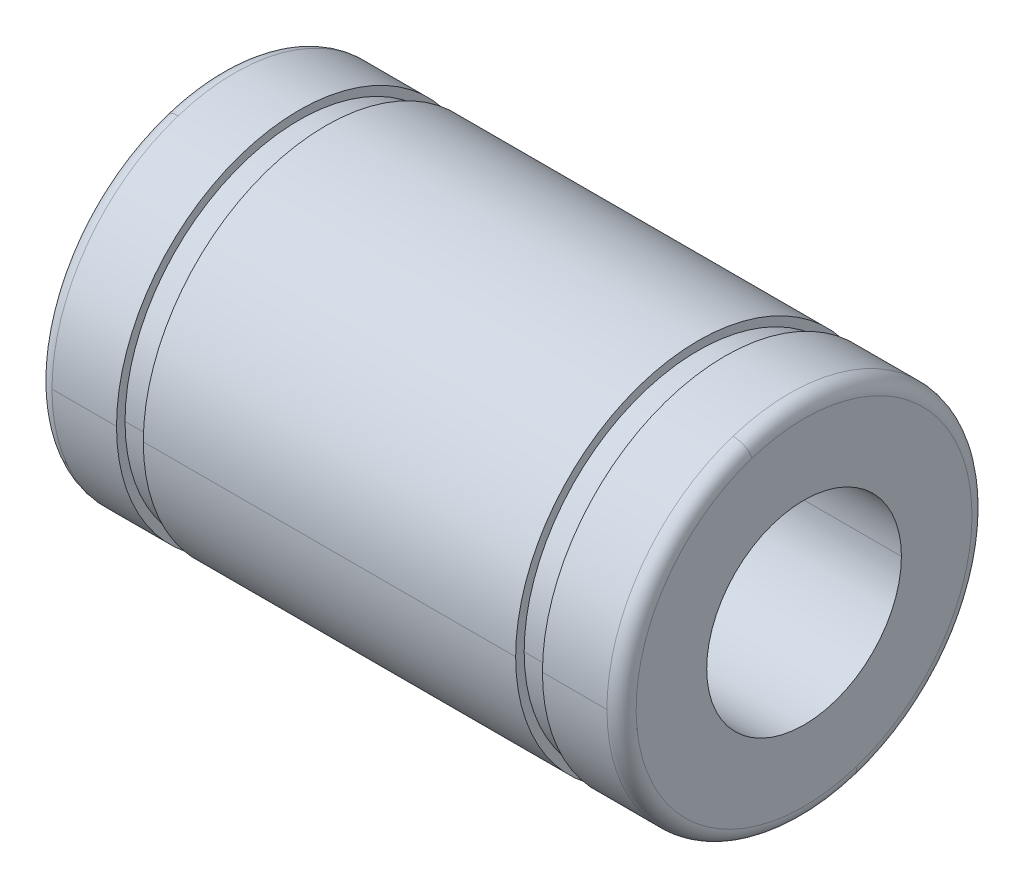
ISO-10303-21;
HEADER;
FILE_DESCRIPTION(('STEP AP214'),'2;1');
FILE_NAME('part.step','',(''),(''),'','','');
FILE_SCHEMA(('AUTOMOTIVE_DESIGN { 1 0 10303 214 1 1 1 1 }'));
ENDSEC;
DATA;
#1=APPLICATION_CONTEXT('core data for automotive mechanical design processes');
#2=APPLICATION_PROTOCOL_DEFINITION('international standard','automotive_design',2000,#1);
#3=PRODUCT_CONTEXT('',#1,'mechanical');
#4=PRODUCT('Part','Part','',(#3));
#5=PRODUCT_RELATED_PRODUCT_CATEGORY('part','',(#4));
#6=PRODUCT_DEFINITION_FORMATION('','',#4);
#7=PRODUCT_DEFINITION_CONTEXT('part definition',#1,'design');
#8=PRODUCT_DEFINITION('design','',#6,#7);
#9=PRODUCT_DEFINITION_SHAPE('','',#8);
#10=(LENGTH_UNIT() NAMED_UNIT(*) SI_UNIT(.MILLI.,.METRE.));
#11=(NAMED_UNIT(*) PLANE_ANGLE_UNIT() SI_UNIT($,.RADIAN.));
#12=(NAMED_UNIT(*) SI_UNIT($,.STERADIAN.) SOLID_ANGLE_UNIT());
#13=UNCERTAINTY_MEASURE_WITH_UNIT(LENGTH_MEASURE(1.E-05),#10,'distance_accuracy_value','');
#14=(GEOMETRIC_REPRESENTATION_CONTEXT(3) GLOBAL_UNCERTAINTY_ASSIGNED_CONTEXT((#13)) GLOBAL_UNIT_ASSIGNED_CONTEXT((#10,
#11,#12)) REPRESENTATION_CONTEXT('',''));
#15=CARTESIAN_POINT('',(0.,0.,0.));
#16=DIRECTION('',(0.,0.,1.));
#17=DIRECTION('',(1.,0.,0.));
#18=AXIS2_PLACEMENT_3D('',#15,#16,#17);
#19=CARTESIAN_POINT('',(0.600000000000046,0.,0.));
#20=DIRECTION('',(1.,0.,0.));
#21=DIRECTION('',(0.,-0.309016994374947,0.951056516295154));
#22=AXIS2_PLACEMENT_3D('',#19,#20,#21);
#23=TOROIDAL_SURFACE('',#22,6.9,0.600000000000046);
#24=CARTESIAN_POINT('',(0.600000000000046,-6.56228996243656,-2.13221726118714));
#25=DIRECTION('',(0.,0.309016994374947,-0.951056516295154));
#26=DIRECTION('',(0.,-0.951056516295154,-0.309016994374947));
#27=AXIS2_PLACEMENT_3D('',#24,#25,#26);
#28=CIRCLE('',#27,0.600000000000046);
#29=CARTESIAN_POINT('',(0.599999999999998,-7.1329238722137,-2.31762745781212));
#30=VERTEX_POINT('',#29);
#31=CARTESIAN_POINT('',(0.,-6.56228996243656,-2.13221726118714));
#32=VERTEX_POINT('',#31);
#33=EDGE_CURVE('E10',#30,#32,#28,.T.);
#34=ORIENTED_EDGE('',*,*,#33,.T.);
#35=CARTESIAN_POINT('',(0.,-6.56228996243656,-2.13221726118714));
#36=CARTESIAN_POINT('',(0.,-6.52740388155008,-2.23959332810784));
#37=CARTESIAN_POINT('',(0.,-6.48987800497312,-2.34611145914393));
#38=CARTESIAN_POINT('',(0.,-6.40964690425732,-2.55717897852581));
#39=CARTESIAN_POINT('',(0.,-6.36694168011848,-2.66172836687159));
#40=CARTESIAN_POINT('',(0.,-6.276452128098,-2.86860552995175));
#41=CARTESIAN_POINT('',(0.,-6.22866780021635,-2.97093330468613));
#42=CARTESIAN_POINT('',(0.,-6.12813586387167,-3.17312099253332));
#43=CARTESIAN_POINT('',(0.,-6.07538825540865,-3.27298090564614));
#44=CARTESIAN_POINT('',(0.,-5.96505664219596,-3.46999222701183));
#45=CARTESIAN_POINT('',(0.,-5.9074726374463,-3.56714363526472));
#46=CARTESIAN_POINT('',(0.,-5.78760700729814,-3.7585039199405));
#47=CARTESIAN_POINT('',(0.,-5.72532538189964,-3.85271279636341));
#48=CARTESIAN_POINT('',(0.,-5.59621453875245,-4.03796105477763));
#49=CARTESIAN_POINT('',(0.,-5.52938532100377,-4.12900043676896));
#50=CARTESIAN_POINT('',(0.,-5.39134029423734,-4.30769038585909));
#51=CARTESIAN_POINT('',(0.,-5.32012448521959,-4.3953409529579));
#52=CARTESIAN_POINT('',(0.,-5.17347784006084,-4.56704211399862));
#53=CARTESIAN_POINT('',(0.,-5.09804700391984,-4.65109270794054));
#54=CARTESIAN_POINT('',(0.,-4.9431520242673,-4.81539143752411));
#55=CARTESIAN_POINT('',(0.,-4.86368788075576,-4.89563957316576));
#56=CARTESIAN_POINT('',(0.,-4.70091772237403,-5.05214006133451));
#57=CARTESIAN_POINT('',(0.,-4.61761170750384,-5.1283924138616));
#58=CARTESIAN_POINT('',(0.,-4.44735849791015,-5.27671763721219));
#59=CARTESIAN_POINT('',(0.,-4.36041130318665,-5.3487905080357));
#60=CARTESIAN_POINT('',(0.,-4.18308519728907,-5.48858313811857));
#61=CARTESIAN_POINT('',(0.,-4.092706286115,-5.55630289737793));
#62=CARTESIAN_POINT('',(0.,-3.9087344780309,-5.68722616150141));
#63=CARTESIAN_POINT('',(0.,-3.81514158112088,-5.75042966636553));
#64=CARTESIAN_POINT('',(0.,-3.62496727505094,-5.87216815891921));
#65=CARTESIAN_POINT('',(0.,-3.52838586589103,-5.93070314660876));
#66=CARTESIAN_POINT('',(0.,-3.33246720839562,-6.04296358890093));
#67=CARTESIAN_POINT('',(0.,-3.23312996006012,-6.09668904350355));
#68=CARTESIAN_POINT('',(0.,-3.03193893634565,-6.19920099029591));
#69=CARTESIAN_POINT('',(0.,-2.93008516096668,-6.24798748248565));
#70=CARTESIAN_POINT('',(0.,-2.72410645783153,-6.34050397351939));
#71=CARTESIAN_POINT('',(0.,-2.61998153007533,-6.38423397236338));
#72=CARTESIAN_POINT('',(0.,-2.40971136825695,-6.4665321273081));
#73=CARTESIAN_POINT('',(0.,-2.30356613419476,-6.50510028340883));
#74=CARTESIAN_POINT('',(0.,-2.08951107293045,-6.57698183880081));
#75=CARTESIAN_POINT('',(0.,-1.98160124572834,-6.61029523809205));
#76=CARTESIAN_POINT('',(0.,-1.76427696240971,-6.67158702496827));
#77=CARTESIAN_POINT('',(0.,-1.65486250629319,-6.69956541255323));
#78=CARTESIAN_POINT('',(0.,-1.43479255415411,-6.75011977363058));
#79=CARTESIAN_POINT('',(0.,-1.32413705813155,-6.77269574712295));
#80=CARTESIAN_POINT('',(0.,-1.10185160496257,-6.81239089251754));
#81=CARTESIAN_POINT('',(0.,-0.990221647816158,-6.82951006441976));
#82=CARTESIAN_POINT('',(0.,-0.766256198743875,-6.85825036504947));
#83=CARTESIAN_POINT('',(0.,-0.653920706818006,-6.86987149377696));
#84=CARTESIAN_POINT('',(0.,-0.428814814226287,-6.8875877117402));
#85=CARTESIAN_POINT('',(0.,-0.316044413560438,-6.89368280097596));
#86=CARTESIAN_POINT('',(0.,-0.0903403772614851,-6.90033225635193));
#87=CARTESIAN_POINT('',(0.,0.0225932583716179,-6.90088662249212));
#88=CARTESIAN_POINT('',(0.,0.24835169758502,-6.89645329616037));
#89=CARTESIAN_POINT('',(0.,0.361176501165319,-6.89146560368842));
#90=CARTESIAN_POINT('',(0.,0.586445471439003,-6.8759601759204));
#91=CARTESIAN_POINT('',(0.,0.698889638132388,-6.86544244062433));
#92=CARTESIAN_POINT('',(0.,0.923126446785733,-6.83890226535365));
#93=CARTESIAN_POINT('',(0.,1.03491908874569,-6.82287982537904));
#94=CARTESIAN_POINT('',(0.,1.25758352966583,-6.78536884021258));
#95=CARTESIAN_POINT('',(0.,1.36845532862601,-6.76388029502073));
#96=CARTESIAN_POINT('',(0.,1.58901098367166,-6.71548886720732));
#97=CARTESIAN_POINT('',(0.,1.69869483975713,-6.68858598458576));
#98=CARTESIAN_POINT('',(0.,1.91661037103689,-6.6294306933136));
#99=CARTESIAN_POINT('',(0.,2.02484204623118,-6.59717828466299));
#100=CARTESIAN_POINT('',(0.,2.23959247614305,-6.52740164021014));
#101=CARTESIAN_POINT('',(0.,2.34611123086064,-6.48987740440789));
#102=CARTESIAN_POINT('',(0.,2.55717920680906,-6.40964750482255));
#103=CARTESIAN_POINT('',(0.,2.66172842803989,-6.36694184103946));
#104=CARTESIAN_POINT('',(0.,2.86860546878342,-6.27645196717703));
#105=CARTESIAN_POINT('',(0.,2.97093328829611,-6.22866775709771));
#106=CARTESIAN_POINT('',(0.,3.17312100892331,-6.12813590699032));
#107=CARTESIAN_POINT('',(0.,3.27298091003781,-6.07538826696226));
#108=CARTESIAN_POINT('',(0.,3.46999222262013,-5.96505663064236));
#109=CARTESIAN_POINT('',(0.,3.56714363408795,-5.90747263435053));
#110=CARTESIAN_POINT('',(0.,3.75850392111724,-5.78760701039393));
#111=CARTESIAN_POINT('',(0.,3.8527127966787,-5.72532538272916));
#112=CARTESIAN_POINT('',(0.,4.03796105446231,-5.59621453792295));
#113=CARTESIAN_POINT('',(0.,4.12900043668446,-5.52938532078152));
#114=CARTESIAN_POINT('',(0.,4.30769038594357,-5.39134029445962));
#115=CARTESIAN_POINT('',(0.,4.39534095298052,-5.32012448527916));
#116=CARTESIAN_POINT('',(0.,4.56704211397597,-5.1734778400013));
#117=CARTESIAN_POINT('',(0.,4.65109270793446,-5.0980470039039));
#118=CARTESIAN_POINT('',(0.,4.81539143753016,-4.94315202428327));
#119=CARTESIAN_POINT('',(0.,4.89563957316737,-4.86368788076005));
#120=CARTESIAN_POINT('',(0.,5.05214006133287,-4.70091772236976));
#121=CARTESIAN_POINT('',(0.,5.12839241386115,-4.6176117075027));
#122=CARTESIAN_POINT('',(0.,5.27671763721261,-4.44735849791131));
#123=CARTESIAN_POINT('',(0.,5.3487905080358,-4.36041130318697));
#124=CARTESIAN_POINT('',(0.,5.48858313811844,-4.18308519728878));
#125=CARTESIAN_POINT('',(0.,5.55630289737789,-4.09270628611493));
#126=CARTESIAN_POINT('',(0.,5.68722616150143,-3.908734478031));
#127=CARTESIAN_POINT('',(0.,5.75042966636553,-3.81514158112092));
#128=CARTESIAN_POINT('',(0.,5.87216815891919,-3.62496727505094));
#129=CARTESIAN_POINT('',(0.,5.93070314660875,-3.52838586589104));
#130=CARTESIAN_POINT('',(0.,6.04296358890093,-3.33246720839564));
#131=CARTESIAN_POINT('',(0.,6.09668904350354,-3.23312996006013));
#132=CARTESIAN_POINT('',(0.,6.1992009902959,-3.03193893634566));
#133=CARTESIAN_POINT('',(0.,6.24798748248564,-2.9300851609667));
#134=CARTESIAN_POINT('',(0.,6.34050397351939,-2.72410645783154));
#135=CARTESIAN_POINT('',(0.,6.3842339723634,-2.61998153007535));
#136=CARTESIAN_POINT('',(0.,6.46653212730807,-2.40971136825697));
#137=CARTESIAN_POINT('',(0.,6.50510028340874,-2.3035661341948));
#138=CARTESIAN_POINT('',(0.,6.57698183880088,-2.08951107293045));
#139=CARTESIAN_POINT('',(0.,6.61029523809236,-1.98160124572827));
#140=CARTESIAN_POINT('',(0.,6.67158702496795,-1.76427696240981));
#141=CARTESIAN_POINT('',(0.,6.69956541255205,-1.65486250629353));
#142=CARTESIAN_POINT('',(0.,6.75011977363176,-1.43479255415381));
#143=CARTESIAN_POINT('',(0.,6.77269574712736,-1.32413705813037));
#144=CARTESIAN_POINT('',(0.,6.81239089251312,-1.10185160496379));
#145=CARTESIAN_POINT('',(0.,6.82951006440328,-0.990221647820649));
#146=CARTESIAN_POINT('',(0.,6.85825036506594,-0.766256198739422));
#147=CARTESIAN_POINT('',(0.,6.86987149383844,-0.653920706801333));
#148=CARTESIAN_POINT('',(0.,6.88758771167871,-0.428814814242999));
#149=CARTESIAN_POINT('',(0.,6.89368280074648,-0.316044413622753));
#150=CARTESIAN_POINT('',(0.,6.9003322565814,-0.0903403771992132));
#151=CARTESIAN_POINT('',(0.,6.90088662334855,0.0225932586040801));
#152=CARTESIAN_POINT('',(0.,6.89645329530395,0.248351697352514));
#153=CARTESIAN_POINT('',(0.,6.8914656004922,0.361176500297654));
#154=CARTESIAN_POINT('',(0.,6.87596017911661,0.586445472306625));
#155=CARTESIAN_POINT('',(0.,6.86544245255276,0.698889641370455));
#156=CARTESIAN_POINT('',(0.,6.83890225342522,0.923126443547625));
#157=CARTESIAN_POINT('',(0.,6.82287978086153,1.03491907666096));
#158=CARTESIAN_POINT('',(0.,6.7853688847301,1.25758354175053));
#159=CARTESIAN_POINT('',(0.,6.76388046116236,1.36845537372675));
#160=CARTESIAN_POINT('',(0.,6.71548870106569,1.58901093857088));
#161=CARTESIAN_POINT('',(0.,6.68858536453675,1.69869467143877));
#162=CARTESIAN_POINT('',(0.,6.62943131336262,1.91661053935521));
#163=CARTESIAN_POINT('',(0.,6.59718059871742,2.02484267440375));
#164=CARTESIAN_POINT('',(0.,6.56228996243657,2.1322172611871));
#165=B_SPLINE_CURVE_WITH_KNOTS('',3,(#35,#36,#37,#38,#39,#40,#41,#42,#43,#44,#45,#46,#47,#48,
#49,#50,#51,#52,#53,#54,#55,#56,#57,#58,#59,#60,#61,#62,#63,#64,#65,#66,#67,#68,#69,#70,#71,#72,
#73,#74,#75,#76,#77,#78,#79,#80,#81,#82,#83,#84,#85,#86,#87,#88,#89,#90,#91,#92,#93,#94,#95,#96,
#97,#98,#99,#100,#101,#102,#103,#104,#105,#106,#107,#108,#109,#110,#111,#112,#113,#114,#115,
#116,#117,#118,#119,#120,#121,#122,#123,#124,#125,#126,#127,#128,#129,#130,#131,#132,#133,#134,
#135,#136,#137,#138,#139,#140,#141,#142,#143,#144,#145,#146,#147,#148,#149,#150,#151,#152,#153,
#154,#155,#156,#157,#158,#159,#160,#161,#162,#163,#164),.UNSPECIFIED.,.F.,.F.,(4,2,2,2,2,2,2,2,
2,2,2,2,2,2,2,2,2,2,2,2,2,2,2,2,2,2,2,2,2,2,2,2,2,2,2,2,2,2,2,2,2,2,2,2,2,2,2,2,2,2,2,2,2,2,2,2,
2,2,2,2,2,2,2,2,4),(0.,0.33866895361619,0.677337907232377,1.01600686084857,1.35467581446475,
1.69334476808095,2.03201372169713,2.37068267531332,2.70935162892951,3.0480205825457,
3.38668953616189,3.72535848977808,4.06402744339427,4.40269639701046,4.74136535062664,
5.08003430424283,5.41870325785902,5.75737221147521,6.0960411650914,6.43471011870759,
6.77337907232378,7.11204802593997,7.45071697955616,7.78938593317234,8.12805488678853,
8.46672384040472,8.80539279402091,9.1440617476371,9.48273070125329,9.82139965486947,
10.1600686084857,10.4987375621019,10.837406515718,11.1760754693342,11.5147444229504,
11.8534133765666,12.1920823301828,12.530751283799,12.8694202374152,13.2080891910314,
13.5467581446476,13.8854270982637,14.2240960518799,14.5627650054961,14.9014339591123,
15.2401029127285,15.5787718663447,15.9174408199609,16.2561097735771,16.5947787271933,
16.9334476808094,17.2721166344256,17.6107855880418,17.949454541658,18.2881234952742,
18.6267924488904,18.9654614025066,19.3041303561228,19.642799309739,19.9814682633552,
20.3201372169713,20.6588061705875,20.9974751242037,21.3361440778199,21.6748130314361),.UNSPECIFIED.);
#166=CARTESIAN_POINT('',(0.,6.56228996243656,2.13221726118714));
#167=VERTEX_POINT('',#166);
#168=EDGE_CURVE('E25',#32,#167,#165,.T.);
#169=ORIENTED_EDGE('',*,*,#168,.T.);
#170=CARTESIAN_POINT('',(0.600000000000046,6.56228996243656,2.13221726118714));
#171=DIRECTION('',(0.,-0.309016994374947,0.951056516295154));
#172=DIRECTION('',(0.,0.951056516295154,0.309016994374947));
#173=AXIS2_PLACEMENT_3D('',#170,#171,#172);
#174=CIRCLE('',#173,0.600000000000046);
#175=CARTESIAN_POINT('',(0.599999999999999,7.1329238722137,2.31762745781212));
#176=VERTEX_POINT('',#175);
#177=EDGE_CURVE('E378',#176,#167,#174,.T.);
#178=ORIENTED_EDGE('',*,*,#177,.F.);
#179=CARTESIAN_POINT('',(0.6,0.,0.));
#180=DIRECTION('',(1.,0.,0.));
#181=DIRECTION('',(0.,0.,-1.));
#182=AXIS2_PLACEMENT_3D('',#179,#180,#181);
#183=CIRCLE('',#182,7.5);
#184=CARTESIAN_POINT('',(0.6,0.,-7.5));
#185=VERTEX_POINT('',#184);
#186=EDGE_CURVE('E373',#185,#176,#183,.T.);
#187=ORIENTED_EDGE('',*,*,#186,.F.);
#188=CARTESIAN_POINT('',(0.6,0.,0.));
#189=DIRECTION('',(1.,0.,0.));
#190=DIRECTION('',(0.,0.,-1.));
#191=AXIS2_PLACEMENT_3D('',#188,#189,#190);
#192=CIRCLE('',#191,7.5);
#193=EDGE_CURVE('E368',#30,#185,#192,.T.);
#194=ORIENTED_EDGE('',*,*,#193,.F.);
#195=EDGE_LOOP('',(#34,#169,#178,#187,#194));
#196=FACE_BOUND('',#195,.T.);
#197=ADVANCED_FACE('F16',(#196),#23,.T.);
#198=CARTESIAN_POINT('',(24.,0.,0.));
#199=DIRECTION('',(1.,0.,0.));
#200=DIRECTION('',(0.,1.,0.));
#201=AXIS2_PLACEMENT_3D('',#198,#199,#200);
#202=CYLINDRICAL_SURFACE('',#201,7.5);
#203=DIRECTION('',(1.,0.,0.));
#204=VECTOR('',#203,1.);
#205=CARTESIAN_POINT('',(0.600000000000001,0.,7.5));
#206=LINE('',#205,#204);
#207=CARTESIAN_POINT('',(0.600000000000001,0.,7.5));
#208=VERTEX_POINT('',#207);
#209=CARTESIAN_POINT('',(3.25,0.,7.5));
#210=VERTEX_POINT('',#209);
#211=EDGE_CURVE('E363',#208,#210,#206,.T.);
#212=ORIENTED_EDGE('',*,*,#211,.F.);
#213=CARTESIAN_POINT('',(0.6,0.,0.));
#214=DIRECTION('',(1.,0.,0.));
#215=DIRECTION('',(0.,0.,-1.));
#216=AXIS2_PLACEMENT_3D('',#213,#214,#215);
#217=CIRCLE('',#216,7.5);
#218=EDGE_CURVE('E358',#208,#30,#217,.T.);
#219=ORIENTED_EDGE('',*,*,#218,.T.);
#220=ORIENTED_EDGE('',*,*,#193,.T.);
#221=DIRECTION('',(1.,0.,0.));
#222=VECTOR('',#221,1.);
#223=CARTESIAN_POINT('',(0.600000000000001,0.,-7.5));
#224=LINE('',#223,#222);
#225=CARTESIAN_POINT('',(3.25,0.,-7.5));
#226=VERTEX_POINT('',#225);
#227=EDGE_CURVE('E354',#185,#226,#224,.T.);
#228=ORIENTED_EDGE('',*,*,#227,.T.);
#229=CARTESIAN_POINT('',(3.25,0.,0.));
#230=DIRECTION('',(1.,0.,0.));
#231=DIRECTION('',(0.,0.,-1.));
#232=AXIS2_PLACEMENT_3D('',#229,#230,#231);
#233=CIRCLE('',#232,7.5);
#234=EDGE_CURVE('E349',#210,#226,#233,.T.);
#235=ORIENTED_EDGE('',*,*,#234,.F.);
#236=EDGE_LOOP('',(#212,#219,#220,#228,#235));
#237=FACE_BOUND('',#236,.T.);
#238=ADVANCED_FACE('F401',(#237),#202,.T.);
#239=CARTESIAN_POINT('',(3.25,7.15,0.));
#240=DIRECTION('',(1.,0.,0.));
#241=DIRECTION('',(0.,0.,-1.));
#242=AXIS2_PLACEMENT_3D('',#239,#240,#241);
#243=PLANE('',#242);
#244=CARTESIAN_POINT('',(3.25,0.,0.));
#245=DIRECTION('',(1.,0.,0.));
#246=DIRECTION('',(0.,0.,-1.));
#247=AXIS2_PLACEMENT_3D('',#244,#245,#246);
#248=CIRCLE('',#247,7.5);
#249=EDGE_CURVE('E344',#226,#210,#248,.T.);
#250=ORIENTED_EDGE('',*,*,#249,.T.);
#251=ORIENTED_EDGE('',*,*,#234,.T.);
#252=EDGE_LOOP('',(#250,#251));
#253=FACE_BOUND('',#252,.T.);
#254=CARTESIAN_POINT('',(3.25,0.,0.));
#255=DIRECTION('',(1.,0.,0.));
#256=DIRECTION('',(0.,0.,-1.));
#257=AXIS2_PLACEMENT_3D('',#254,#255,#256);
#258=CIRCLE('',#257,7.15);
#259=CARTESIAN_POINT('',(3.25,0.,7.15));
#260=VERTEX_POINT('',#259);
#261=CARTESIAN_POINT('',(3.25,0.,-7.15));
#262=VERTEX_POINT('',#261);
#263=EDGE_CURVE('E339',#260,#262,#258,.T.);
#264=ORIENTED_EDGE('',*,*,#263,.F.);
#265=CARTESIAN_POINT('',(3.25,0.,0.));
#266=DIRECTION('',(1.,0.,0.));
#267=DIRECTION('',(0.,0.,-1.));
#268=AXIS2_PLACEMENT_3D('',#265,#266,#267);
#269=CIRCLE('',#268,7.15);
#270=EDGE_CURVE('E334',#262,#260,#269,.T.);
#271=ORIENTED_EDGE('',*,*,#270,.F.);
#272=EDGE_LOOP('',(#264,#271));
#273=FACE_BOUND('',#272,.T.);
#274=ADVANCED_FACE('F405',(#253,#273),#243,.T.);
#275=CARTESIAN_POINT('',(24.,0.,0.));
#276=DIRECTION('',(1.,0.,0.));
#277=DIRECTION('',(0.,-1.,0.));
#278=AXIS2_PLACEMENT_3D('',#275,#276,#277);
#279=CYLINDRICAL_SURFACE('',#278,7.15);
#280=DIRECTION('',(1.,0.,0.));
#281=VECTOR('',#280,1.);
#282=CARTESIAN_POINT('',(3.25,0.,7.15));
#283=LINE('',#282,#281);
#284=CARTESIAN_POINT('',(4.35,0.,7.15));
#285=VERTEX_POINT('',#284);
#286=EDGE_CURVE('E330',#260,#285,#283,.T.);
#287=ORIENTED_EDGE('',*,*,#286,.T.);
#288=CARTESIAN_POINT('',(4.35,0.,0.));
#289=DIRECTION('',(1.,0.,0.));
#290=DIRECTION('',(0.,0.,-1.));
#291=AXIS2_PLACEMENT_3D('',#288,#289,#290);
#292=CIRCLE('',#291,7.15);
#293=CARTESIAN_POINT('',(4.35,0.,-7.15));
#294=VERTEX_POINT('',#293);
#295=EDGE_CURVE('E325',#294,#285,#292,.T.);
#296=ORIENTED_EDGE('',*,*,#295,.F.);
#297=DIRECTION('',(1.,0.,0.));
#298=VECTOR('',#297,1.);
#299=CARTESIAN_POINT('',(3.25,0.,-7.15));
#300=LINE('',#299,#298);
#301=EDGE_CURVE('E320',#262,#294,#300,.T.);
#302=ORIENTED_EDGE('',*,*,#301,.F.);
#303=ORIENTED_EDGE('',*,*,#270,.T.);
#304=EDGE_LOOP('',(#287,#296,#302,#303));
#305=FACE_BOUND('',#304,.T.);
#306=ADVANCED_FACE('F446',(#305),#279,.T.);
#307=CARTESIAN_POINT('',(24.,0.,0.));
#308=DIRECTION('',(1.,0.,0.));
#309=DIRECTION('',(0.,1.,0.));
#310=AXIS2_PLACEMENT_3D('',#307,#308,#309);
#311=CYLINDRICAL_SURFACE('',#310,7.15);
#312=ORIENTED_EDGE('',*,*,#286,.F.);
#313=ORIENTED_EDGE('',*,*,#263,.T.);
#314=ORIENTED_EDGE('',*,*,#301,.T.);
#315=CARTESIAN_POINT('',(4.35,0.,0.));
#316=DIRECTION('',(1.,0.,0.));
#317=DIRECTION('',(0.,0.,-1.));
#318=AXIS2_PLACEMENT_3D('',#315,#316,#317);
#319=CIRCLE('',#318,7.15);
#320=EDGE_CURVE('E315',#285,#294,#319,.T.);
#321=ORIENTED_EDGE('',*,*,#320,.F.);
#322=EDGE_LOOP('',(#312,#313,#314,#321));
#323=FACE_BOUND('',#322,.T.);
#324=ADVANCED_FACE('F451',(#323),#311,.T.);
#325=CARTESIAN_POINT('',(4.35,7.5,0.));
#326=DIRECTION('',(-1.,0.,0.));
#327=DIRECTION('',(0.,0.,1.));
#328=AXIS2_PLACEMENT_3D('',#325,#326,#327);
#329=PLANE('',#328);
#330=ORIENTED_EDGE('',*,*,#295,.T.);
#331=ORIENTED_EDGE('',*,*,#320,.T.);
#332=EDGE_LOOP('',(#330,#331));
#333=FACE_BOUND('',#332,.T.);
#334=CARTESIAN_POINT('',(4.35,0.,0.));
#335=DIRECTION('',(1.,0.,0.));
#336=DIRECTION('',(0.,0.,-1.));
#337=AXIS2_PLACEMENT_3D('',#334,#335,#336);
#338=CIRCLE('',#337,7.5);
#339=CARTESIAN_POINT('',(4.35,0.,7.5));
#340=VERTEX_POINT('',#339);
#341=CARTESIAN_POINT('',(4.35,0.,-7.5));
#342=VERTEX_POINT('',#341);
#343=EDGE_CURVE('E310',#340,#342,#338,.T.);
#344=ORIENTED_EDGE('',*,*,#343,.F.);
#345=CARTESIAN_POINT('',(4.35,0.,0.));
#346=DIRECTION('',(1.,0.,0.));
#347=DIRECTION('',(0.,0.,-1.));
#348=AXIS2_PLACEMENT_3D('',#345,#346,#347);
#349=CIRCLE('',#348,7.5);
#350=EDGE_CURVE('E305',#342,#340,#349,.T.);
#351=ORIENTED_EDGE('',*,*,#350,.F.);
#352=EDGE_LOOP('',(#344,#351));
#353=FACE_BOUND('',#352,.T.);
#354=ADVANCED_FACE('F455',(#333,#353),#329,.T.);
#355=CARTESIAN_POINT('',(24.,0.,0.));
#356=DIRECTION('',(1.,0.,0.));
#357=DIRECTION('',(0.,-1.,0.));
#358=AXIS2_PLACEMENT_3D('',#355,#356,#357);
#359=CYLINDRICAL_SURFACE('',#358,7.5);
#360=DIRECTION('',(1.,0.,0.));
#361=VECTOR('',#360,1.);
#362=CARTESIAN_POINT('',(4.35,0.,7.5));
#363=LINE('',#362,#361);
#364=CARTESIAN_POINT('',(19.65,0.,7.5));
#365=VERTEX_POINT('',#364);
#366=EDGE_CURVE('E301',#340,#365,#363,.T.);
#367=ORIENTED_EDGE('',*,*,#366,.T.);
#368=CARTESIAN_POINT('',(19.65,0.,0.));
#369=DIRECTION('',(1.,0.,0.));
#370=DIRECTION('',(0.,0.,-1.));
#371=AXIS2_PLACEMENT_3D('',#368,#369,#370);
#372=CIRCLE('',#371,7.5);
#373=CARTESIAN_POINT('',(19.65,0.,-7.5));
#374=VERTEX_POINT('',#373);
#375=EDGE_CURVE('E296',#374,#365,#372,.T.);
#376=ORIENTED_EDGE('',*,*,#375,.F.);
#377=DIRECTION('',(1.,0.,0.));
#378=VECTOR('',#377,1.);
#379=CARTESIAN_POINT('',(4.35,0.,-7.5));
#380=LINE('',#379,#378);
#381=EDGE_CURVE('E291',#342,#374,#380,.T.);
#382=ORIENTED_EDGE('',*,*,#381,.F.);
#383=ORIENTED_EDGE('',*,*,#350,.T.);
#384=EDGE_LOOP('',(#367,#376,#382,#383));
#385=FACE_BOUND('',#384,.T.);
#386=ADVANCED_FACE('F459',(#385),#359,.T.);
#387=CARTESIAN_POINT('',(24.,0.,0.));
#388=DIRECTION('',(1.,0.,0.));
#389=DIRECTION('',(0.,1.,0.));
#390=AXIS2_PLACEMENT_3D('',#387,#388,#389);
#391=CYLINDRICAL_SURFACE('',#390,7.5);
#392=ORIENTED_EDGE('',*,*,#366,.F.);
#393=ORIENTED_EDGE('',*,*,#343,.T.);
#394=ORIENTED_EDGE('',*,*,#381,.T.);
#395=CARTESIAN_POINT('',(19.65,0.,0.));
#396=DIRECTION('',(1.,0.,0.));
#397=DIRECTION('',(0.,0.,-1.));
#398=AXIS2_PLACEMENT_3D('',#395,#396,#397);
#399=CIRCLE('',#398,7.5);
#400=EDGE_CURVE('E286',#365,#374,#399,.T.);
#401=ORIENTED_EDGE('',*,*,#400,.F.);
#402=EDGE_LOOP('',(#392,#393,#394,#401));
#403=FACE_BOUND('',#402,.T.);
#404=ADVANCED_FACE('F463',(#403),#391,.T.);
#405=CARTESIAN_POINT('',(19.65,7.15,0.));
#406=DIRECTION('',(1.,0.,0.));
#407=DIRECTION('',(0.,0.,-1.));
#408=AXIS2_PLACEMENT_3D('',#405,#406,#407);
#409=PLANE('',#408);
#410=ORIENTED_EDGE('',*,*,#375,.T.);
#411=ORIENTED_EDGE('',*,*,#400,.T.);
#412=EDGE_LOOP('',(#410,#411));
#413=FACE_BOUND('',#412,.T.);
#414=CARTESIAN_POINT('',(19.65,0.,0.));
#415=DIRECTION('',(1.,0.,0.));
#416=DIRECTION('',(0.,0.,-1.));
#417=AXIS2_PLACEMENT_3D('',#414,#415,#416);
#418=CIRCLE('',#417,7.15);
#419=CARTESIAN_POINT('',(19.65,0.,7.15));
#420=VERTEX_POINT('',#419);
#421=CARTESIAN_POINT('',(19.65,0.,-7.15));
#422=VERTEX_POINT('',#421);
#423=EDGE_CURVE('E281',#420,#422,#418,.T.);
#424=ORIENTED_EDGE('',*,*,#423,.F.);
#425=CARTESIAN_POINT('',(19.65,0.,0.));
#426=DIRECTION('',(1.,0.,0.));
#427=DIRECTION('',(0.,0.,-1.));
#428=AXIS2_PLACEMENT_3D('',#425,#426,#427);
#429=CIRCLE('',#428,7.15);
#430=EDGE_CURVE('E276',#422,#420,#429,.T.);
#431=ORIENTED_EDGE('',*,*,#430,.F.);
#432=EDGE_LOOP('',(#424,#431));
#433=FACE_BOUND('',#432,.T.);
#434=ADVANCED_FACE('F467',(#413,#433),#409,.T.);
#435=CARTESIAN_POINT('',(24.,0.,0.));
#436=DIRECTION('',(1.,0.,0.));
#437=DIRECTION('',(0.,-1.,0.));
#438=AXIS2_PLACEMENT_3D('',#435,#436,#437);
#439=CYLINDRICAL_SURFACE('',#438,7.15);
#440=DIRECTION('',(1.,0.,0.));
#441=VECTOR('',#440,1.);
#442=CARTESIAN_POINT('',(19.65,0.,7.15));
#443=LINE('',#442,#441);
#444=CARTESIAN_POINT('',(20.75,0.,7.15));
#445=VERTEX_POINT('',#444);
#446=EDGE_CURVE('E272',#420,#445,#443,.T.);
#447=ORIENTED_EDGE('',*,*,#446,.T.);
#448=CARTESIAN_POINT('',(20.75,0.,0.));
#449=DIRECTION('',(1.,0.,0.));
#450=DIRECTION('',(0.,0.,-1.));
#451=AXIS2_PLACEMENT_3D('',#448,#449,#450);
#452=CIRCLE('',#451,7.15);
#453=CARTESIAN_POINT('',(20.75,0.,-7.15));
#454=VERTEX_POINT('',#453);
#455=EDGE_CURVE('E267',#454,#445,#452,.T.);
#456=ORIENTED_EDGE('',*,*,#455,.F.);
#457=DIRECTION('',(1.,0.,0.));
#458=VECTOR('',#457,1.);
#459=CARTESIAN_POINT('',(19.65,0.,-7.15));
#460=LINE('',#459,#458);
#461=EDGE_CURVE('E262',#422,#454,#460,.T.);
#462=ORIENTED_EDGE('',*,*,#461,.F.);
#463=ORIENTED_EDGE('',*,*,#430,.T.);
#464=EDGE_LOOP('',(#447,#456,#462,#463));
#465=FACE_BOUND('',#464,.T.);
#466=ADVANCED_FACE('F471',(#465),#439,.T.);
#467=CARTESIAN_POINT('',(24.,0.,0.));
#468=DIRECTION('',(1.,0.,0.));
#469=DIRECTION('',(0.,1.,0.));
#470=AXIS2_PLACEMENT_3D('',#467,#468,#469);
#471=CYLINDRICAL_SURFACE('',#470,7.15);
#472=ORIENTED_EDGE('',*,*,#446,.F.);
#473=ORIENTED_EDGE('',*,*,#423,.T.);
#474=ORIENTED_EDGE('',*,*,#461,.T.);
#475=CARTESIAN_POINT('',(20.75,0.,0.));
#476=DIRECTION('',(1.,0.,0.));
#477=DIRECTION('',(0.,0.,-1.));
#478=AXIS2_PLACEMENT_3D('',#475,#476,#477);
#479=CIRCLE('',#478,7.15);
#480=EDGE_CURVE('E257',#445,#454,#479,.T.);
#481=ORIENTED_EDGE('',*,*,#480,.F.);
#482=EDGE_LOOP('',(#472,#473,#474,#481));
#483=FACE_BOUND('',#482,.T.);
#484=ADVANCED_FACE('F475',(#483),#471,.T.);
#485=CARTESIAN_POINT('',(20.75,7.5,0.));
#486=DIRECTION('',(-1.,0.,0.));
#487=DIRECTION('',(0.,0.,1.));
#488=AXIS2_PLACEMENT_3D('',#485,#486,#487);
#489=PLANE('',#488);
#490=ORIENTED_EDGE('',*,*,#455,.T.);
#491=ORIENTED_EDGE('',*,*,#480,.T.);
#492=EDGE_LOOP('',(#490,#491));
#493=FACE_BOUND('',#492,.T.);
#494=CARTESIAN_POINT('',(20.75,0.,0.));
#495=DIRECTION('',(1.,0.,0.));
#496=DIRECTION('',(0.,0.,-1.));
#497=AXIS2_PLACEMENT_3D('',#494,#495,#496);
#498=CIRCLE('',#497,7.5);
#499=CARTESIAN_POINT('',(20.75,0.,7.5));
#500=VERTEX_POINT('',#499);
#501=CARTESIAN_POINT('',(20.75,0.,-7.5));
#502=VERTEX_POINT('',#501);
#503=EDGE_CURVE('E252',#500,#502,#498,.T.);
#504=ORIENTED_EDGE('',*,*,#503,.F.);
#505=CARTESIAN_POINT('',(20.75,0.,0.));
#506=DIRECTION('',(1.,0.,0.));
#507=DIRECTION('',(0.,0.,-1.));
#508=AXIS2_PLACEMENT_3D('',#505,#506,#507);
#509=CIRCLE('',#508,7.5);
#510=EDGE_CURVE('E247',#502,#500,#509,.T.);
#511=ORIENTED_EDGE('',*,*,#510,.F.);
#512=EDGE_LOOP('',(#504,#511));
#513=FACE_BOUND('',#512,.T.);
#514=ADVANCED_FACE('F479',(#493,#513),#489,.T.);
#515=CARTESIAN_POINT('',(24.,0.,0.));
#516=DIRECTION('',(1.,0.,0.));
#517=DIRECTION('',(0.,-1.,0.));
#518=AXIS2_PLACEMENT_3D('',#515,#516,#517);
#519=CYLINDRICAL_SURFACE('',#518,7.5);
#520=DIRECTION('',(1.,0.,0.));
#521=VECTOR('',#520,1.);
#522=CARTESIAN_POINT('',(20.75,0.,7.5));
#523=LINE('',#522,#521);
#524=CARTESIAN_POINT('',(23.4,0.,7.5));
#525=VERTEX_POINT('',#524);
#526=EDGE_CURVE('E243',#500,#525,#523,.T.);
#527=ORIENTED_EDGE('',*,*,#526,.T.);
#528=CARTESIAN_POINT('',(23.4,0.,0.));
#529=DIRECTION('',(1.,0.,0.));
#530=DIRECTION('',(0.,0.,-1.));
#531=AXIS2_PLACEMENT_3D('',#528,#529,#530);
#532=CIRCLE('',#531,7.5);
#533=CARTESIAN_POINT('',(23.4,7.13292387221366,2.31762745781211));
#534=VERTEX_POINT('',#533);
#535=EDGE_CURVE('E238',#534,#525,#532,.T.);
#536=ORIENTED_EDGE('',*,*,#535,.F.);
#537=CARTESIAN_POINT('',(23.4,0.,0.));
#538=DIRECTION('',(1.,0.,0.));
#539=DIRECTION('',(0.,0.,-1.));
#540=AXIS2_PLACEMENT_3D('',#537,#538,#539);
#541=CIRCLE('',#540,7.5);
#542=CARTESIAN_POINT('',(23.4,0.,-7.5));
#543=VERTEX_POINT('',#542);
#544=EDGE_CURVE('E233',#543,#534,#541,.T.);
#545=ORIENTED_EDGE('',*,*,#544,.F.);
#546=DIRECTION('',(1.,0.,0.));
#547=VECTOR('',#546,1.);
#548=CARTESIAN_POINT('',(20.75,0.,-7.5));
#549=LINE('',#548,#547);
#550=EDGE_CURVE('E228',#502,#543,#549,.T.);
#551=ORIENTED_EDGE('',*,*,#550,.F.);
#552=ORIENTED_EDGE('',*,*,#510,.T.);
#553=EDGE_LOOP('',(#527,#536,#545,#551,#552));
#554=FACE_BOUND('',#553,.T.);
#555=ADVANCED_FACE('F483',(#554),#519,.T.);
#556=CARTESIAN_POINT('',(24.,0.,0.));
#557=DIRECTION('',(1.,0.,0.));
#558=DIRECTION('',(0.,1.,0.));
#559=AXIS2_PLACEMENT_3D('',#556,#557,#558);
#560=CYLINDRICAL_SURFACE('',#559,7.5);
#561=ORIENTED_EDGE('',*,*,#526,.F.);
#562=ORIENTED_EDGE('',*,*,#503,.T.);
#563=ORIENTED_EDGE('',*,*,#550,.T.);
#564=CARTESIAN_POINT('',(23.4,0.,0.));
#565=DIRECTION('',(1.,0.,0.));
#566=DIRECTION('',(0.,0.,-1.));
#567=AXIS2_PLACEMENT_3D('',#564,#565,#566);
#568=CIRCLE('',#567,7.5);
#569=CARTESIAN_POINT('',(23.4,-7.13292387221366,-2.31762745781211));
#570=VERTEX_POINT('',#569);
#571=EDGE_CURVE('E223',#570,#543,#568,.T.);
#572=ORIENTED_EDGE('',*,*,#571,.F.);
#573=CARTESIAN_POINT('',(23.4,0.,0.));
#574=DIRECTION('',(1.,0.,0.));
#575=DIRECTION('',(0.,0.,-1.));
#576=AXIS2_PLACEMENT_3D('',#573,#574,#575);
#577=CIRCLE('',#576,7.5);
#578=EDGE_CURVE('E218',#525,#570,#577,.T.);
#579=ORIENTED_EDGE('',*,*,#578,.F.);
#580=EDGE_LOOP('',(#561,#562,#563,#572,#579));
#581=FACE_BOUND('',#580,.T.);
#582=ADVANCED_FACE('F486',(#581),#560,.T.);
#583=CARTESIAN_POINT('',(23.4,0.,0.));
#584=DIRECTION('',(1.,0.,0.));
#585=DIRECTION('',(0.,0.309016994374947,-0.951056516295154));
#586=AXIS2_PLACEMENT_3D('',#583,#584,#585);
#587=TOROIDAL_SURFACE('',#586,6.90000000000008,0.599999999999924);
#588=CARTESIAN_POINT('',(23.4,-6.56228996243664,-2.13221726118716));
#589=DIRECTION('',(0.,0.309016994374947,-0.951056516295154));
#590=DIRECTION('',(1.,0.,0.));
#591=AXIS2_PLACEMENT_3D('',#588,#589,#590);
#592=CIRCLE('',#591,0.599999999999923);
#593=CARTESIAN_POINT('',(23.9999999999999,-6.56228996243664,-2.13221726118716));
#594=VERTEX_POINT('',#593);
#595=EDGE_CURVE('E214',#594,#570,#592,.T.);
#596=ORIENTED_EDGE('',*,*,#595,.F.);
#597=CARTESIAN_POINT('',(24.,0.,0.));
#598=DIRECTION('',(1.,0.,0.));
#599=DIRECTION('',(0.,0.,-1.));
#600=AXIS2_PLACEMENT_3D('',#597,#598,#599);
#601=CIRCLE('',#600,6.9);
#602=CARTESIAN_POINT('',(23.9999999999999,6.56228996243664,2.13221726118716));
#603=VERTEX_POINT('',#602);
#604=EDGE_CURVE('E210',#603,#594,#601,.T.);
#605=ORIENTED_EDGE('',*,*,#604,.F.);
#606=CARTESIAN_POINT('',(23.4,6.56228996243664,2.13221726118716));
#607=DIRECTION('',(0.,-0.309016994374947,0.951056516295154));
#608=DIRECTION('',(1.,0.,0.));
#609=AXIS2_PLACEMENT_3D('',#606,#607,#608);
#610=CIRCLE('',#609,0.599999999999923);
#611=EDGE_CURVE('E207',#603,#534,#610,.T.);
#612=ORIENTED_EDGE('',*,*,#611,.T.);
#613=ORIENTED_EDGE('',*,*,#535,.T.);
#614=ORIENTED_EDGE('',*,*,#578,.T.);
#615=EDGE_LOOP('',(#596,#605,#612,#613,#614));
#616=FACE_BOUND('',#615,.T.);
#617=ADVANCED_FACE('F191',(#616),#587,.T.);
#618=CARTESIAN_POINT('',(23.4,0.,0.));
#619=DIRECTION('',(1.,0.,0.));
#620=DIRECTION('',(0.,-0.309016994374947,0.951056516295154));
#621=AXIS2_PLACEMENT_3D('',#618,#619,#620);
#622=TOROIDAL_SURFACE('',#621,6.90000000000008,0.599999999999924);
#623=ORIENTED_EDGE('',*,*,#595,.T.);
#624=ORIENTED_EDGE('',*,*,#571,.T.);
#625=ORIENTED_EDGE('',*,*,#544,.T.);
#626=ORIENTED_EDGE('',*,*,#611,.F.);
#627=CARTESIAN_POINT('',(24.,-6.56228996243656,-2.13221726118714));
#628=CARTESIAN_POINT('',(24.,-5.89180628888247,-4.19290469372838));
#629=CARTESIAN_POINT('',(24.,-4.41570698087307,-5.9961864744647));
#630=CARTESIAN_POINT('',(24.,-2.25427276771423,-7.0946877693386));
#631=CARTESIAN_POINT('',(24.,2.39462199649416,-7.36988869636779));
#632=CARTESIAN_POINT('',(24.,5.99389781947445,-4.41469468767206));
#633=CARTESIAN_POINT('',(24.,7.09685196939239,-2.25552931748101));
#634=CARTESIAN_POINT('',(24.,7.23109895851252,0.0709856929484185));
#635=CARTESIAN_POINT('',(24.,6.56228996243656,2.13221726118713));
#636=B_SPLINE_CURVE_WITH_KNOTS('',5,(#627,#628,#629,#630,#631,#632,#633,#634,#635),
.UNSPECIFIED.,.F.,.F.,(6,3,6),(0.,1.5707963267949,3.14159265358979),.UNSPECIFIED.);
#637=EDGE_CURVE('E166',#594,#603,#636,.T.);
#638=ORIENTED_EDGE('',*,*,#637,.F.);
#639=EDGE_LOOP('',(#623,#624,#625,#626,#638));
#640=FACE_BOUND('',#639,.T.);
#641=ADVANCED_FACE('F185',(#640),#622,.T.);
#642=CARTESIAN_POINT('',(24.,4.,0.));
#643=DIRECTION('',(1.,0.,0.));
#644=DIRECTION('',(0.,0.,-1.));
#645=AXIS2_PLACEMENT_3D('',#642,#643,#644);
#646=PLANE('',#645);
#647=ORIENTED_EDGE('',*,*,#604,.T.);
#648=ORIENTED_EDGE('',*,*,#637,.T.);
#649=EDGE_LOOP('',(#647,#648));
#650=FACE_BOUND('',#649,.T.);
#651=CARTESIAN_POINT('',(24.,0.,0.));
#652=DIRECTION('',(1.,0.,0.));
#653=DIRECTION('',(0.,0.,-1.));
#654=AXIS2_PLACEMENT_3D('',#651,#652,#653);
#655=CIRCLE('',#654,4.);
#656=CARTESIAN_POINT('',(24.,0.,4.));
#657=VERTEX_POINT('',#656);
#658=CARTESIAN_POINT('',(24.,0.,-4.));
#659=VERTEX_POINT('',#658);
#660=EDGE_CURVE('E142',#657,#659,#655,.T.);
#661=ORIENTED_EDGE('',*,*,#660,.F.);
#662=CARTESIAN_POINT('',(24.,0.,0.));
#663=DIRECTION('',(1.,0.,0.));
#664=DIRECTION('',(0.,0.,-1.));
#665=AXIS2_PLACEMENT_3D('',#662,#663,#664);
#666=CIRCLE('',#665,4.);
#667=EDGE_CURVE('E159',#659,#657,#666,.T.);
#668=ORIENTED_EDGE('',*,*,#667,.F.);
#669=EDGE_LOOP('',(#661,#668));
#670=FACE_BOUND('',#669,.T.);
#671=ADVANCED_FACE('F175',(#650,#670),#646,.T.);
#672=CARTESIAN_POINT('',(24.,0.,0.));
#673=DIRECTION('',(1.,0.,0.));
#674=DIRECTION('',(0.,-1.,0.));
#675=AXIS2_PLACEMENT_3D('',#672,#673,#674);
#676=CYLINDRICAL_SURFACE('',#675,4.);
#677=DIRECTION('',(1.,0.,0.));
#678=VECTOR('',#677,1.);
#679=CARTESIAN_POINT('',(0.,0.,4.));
#680=LINE('',#679,#678);
#681=CARTESIAN_POINT('',(0.,0.,4.));
#682=VERTEX_POINT('',#681);
#683=EDGE_CURVE('E134',#682,#657,#680,.T.);
#684=ORIENTED_EDGE('',*,*,#683,.F.);
#685=CARTESIAN_POINT('',(0.,0.,0.));
#686=DIRECTION('',(1.,0.,0.));
#687=DIRECTION('',(0.,0.,-1.));
#688=AXIS2_PLACEMENT_3D('',#685,#686,#687);
#689=CIRCLE('',#688,4.);
#690=CARTESIAN_POINT('',(0.,0.,-4.));
#691=VERTEX_POINT('',#690);
#692=EDGE_CURVE('E127',#691,#682,#689,.T.);
#693=ORIENTED_EDGE('',*,*,#692,.F.);
#694=DIRECTION('',(1.,0.,0.));
#695=VECTOR('',#694,1.);
#696=CARTESIAN_POINT('',(0.,0.,-4.));
#697=LINE('',#696,#695);
#698=EDGE_CURVE('E131',#691,#659,#697,.T.);
#699=ORIENTED_EDGE('',*,*,#698,.T.);
#700=ORIENTED_EDGE('',*,*,#667,.T.);
#701=EDGE_LOOP('',(#684,#693,#699,#700));
#702=FACE_BOUND('',#701,.T.);
#703=ADVANCED_FACE('F129',(#702),#676,.F.);
#704=CARTESIAN_POINT('',(24.,0.,0.));
#705=DIRECTION('',(1.,0.,0.));
#706=DIRECTION('',(0.,1.,0.));
#707=AXIS2_PLACEMENT_3D('',#704,#705,#706);
#708=CYLINDRICAL_SURFACE('',#707,4.);
#709=ORIENTED_EDGE('',*,*,#683,.T.);
#710=ORIENTED_EDGE('',*,*,#660,.T.);
#711=ORIENTED_EDGE('',*,*,#698,.F.);
#712=CARTESIAN_POINT('',(0.,0.,0.));
#713=DIRECTION('',(1.,0.,0.));
#714=DIRECTION('',(0.,0.,-1.));
#715=AXIS2_PLACEMENT_3D('',#712,#713,#714);
#716=CIRCLE('',#715,4.);
#717=EDGE_CURVE('E141',#682,#691,#716,.T.);
#718=ORIENTED_EDGE('',*,*,#717,.F.);
#719=EDGE_LOOP('',(#709,#710,#711,#718));
#720=FACE_BOUND('',#719,.T.);
#721=ADVANCED_FACE('F140',(#720),#708,.F.);
#722=CARTESIAN_POINT('',(0.,6.9,0.));
#723=DIRECTION('',(-1.,0.,0.));
#724=DIRECTION('',(0.,0.,1.));
#725=AXIS2_PLACEMENT_3D('',#722,#723,#724);
#726=PLANE('',#725);
#727=ORIENTED_EDGE('',*,*,#692,.T.);
#728=ORIENTED_EDGE('',*,*,#717,.T.);
#729=EDGE_LOOP('',(#727,#728));
#730=FACE_BOUND('',#729,.T.);
#731=ORIENTED_EDGE('',*,*,#168,.F.);
#732=CARTESIAN_POINT('',(0.,6.56228996243656,2.13221726118714));
#733=CARTESIAN_POINT('',(0.,6.52740388155007,2.23959332810784));
#734=CARTESIAN_POINT('',(0.,6.48987800497312,2.34611145914393));
#735=CARTESIAN_POINT('',(0.,6.40964690425732,2.55717897852581));
#736=CARTESIAN_POINT('',(0.,6.36694168011848,2.66172836687159));
#737=CARTESIAN_POINT('',(0.,6.276452128098,2.86860552995175));
#738=CARTESIAN_POINT('',(0.,6.22866780021635,2.97093330468613));
#739=CARTESIAN_POINT('',(0.,6.12813586387167,3.17312099253333));
#740=CARTESIAN_POINT('',(0.,6.07538825540864,3.27298090564614));
#741=CARTESIAN_POINT('',(0.,5.96505664219596,3.46999222701184));
#742=CARTESIAN_POINT('',(0.,5.9074726374463,3.56714363526472));
#743=CARTESIAN_POINT('',(0.,5.78760700729814,3.75850391994051));
#744=CARTESIAN_POINT('',(0.,5.72532538189964,3.85271279636341));
#745=CARTESIAN_POINT('',(0.,5.59621453875245,4.03796105477764));
#746=CARTESIAN_POINT('',(0.,5.52938532100377,4.12900043676896));
#747=CARTESIAN_POINT('',(0.,5.39134029423734,4.3076903858591));
#748=CARTESIAN_POINT('',(0.,5.32012448521959,4.3953409529579));
#749=CARTESIAN_POINT('',(0.,5.17347784006084,4.56704211399863));
#750=CARTESIAN_POINT('',(0.,5.09804700391984,4.65109270794054));
#751=CARTESIAN_POINT('',(0.,4.9431520242673,4.81539143752411));
#752=CARTESIAN_POINT('',(0.,4.86368788075576,4.89563957316576));
#753=CARTESIAN_POINT('',(0.,4.70091772237402,5.05214006133451));
#754=CARTESIAN_POINT('',(0.,4.61761170750383,5.1283924138616));
#755=CARTESIAN_POINT('',(0.,4.44735849791014,5.27671763721219));
#756=CARTESIAN_POINT('',(0.,4.36041130318664,5.3487905080357));
#757=CARTESIAN_POINT('',(0.,4.18308519728907,5.48858313811857));
#758=CARTESIAN_POINT('',(0.,4.092706286115,5.55630289737793));
#759=CARTESIAN_POINT('',(0.,3.9087344780309,5.68722616150141));
#760=CARTESIAN_POINT('',(0.,3.81514158112087,5.75042966636554));
#761=CARTESIAN_POINT('',(0.,3.62496727505094,5.87216815891921));
#762=CARTESIAN_POINT('',(0.,3.52838586589103,5.93070314660876));
#763=CARTESIAN_POINT('',(0.,3.33246720839561,6.04296358890094));
#764=CARTESIAN_POINT('',(0.,3.23312996006011,6.09668904350355));
#765=CARTESIAN_POINT('',(0.,3.03193893634565,6.19920099029591));
#766=CARTESIAN_POINT('',(0.,2.93008516096668,6.24798748248565));
#767=CARTESIAN_POINT('',(0.,2.72410645783153,6.34050397351939));
#768=CARTESIAN_POINT('',(0.,2.61998153007533,6.38423397236338));
#769=CARTESIAN_POINT('',(0.,2.40971136825694,6.4665321273081));
#770=CARTESIAN_POINT('',(0.,2.30356613419475,6.50510028340883));
#771=CARTESIAN_POINT('',(0.,2.08951107293045,6.57698183880081));
#772=CARTESIAN_POINT('',(0.,1.98160124572833,6.61029523809205));
#773=CARTESIAN_POINT('',(0.,1.7642769624097,6.67158702496827));
#774=CARTESIAN_POINT('',(0.,1.65486250629319,6.69956541255324));
#775=CARTESIAN_POINT('',(0.,1.43479255415411,6.75011977363058));
#776=CARTESIAN_POINT('',(0.,1.32413705813154,6.77269574712295));
#777=CARTESIAN_POINT('',(0.,1.10185160496257,6.81239089251755));
#778=CARTESIAN_POINT('',(0.,0.990221647816152,6.82951006441977));
#779=CARTESIAN_POINT('',(0.,0.766256198743869,6.85825036504947));
#780=CARTESIAN_POINT('',(0.,0.653920706817999,6.86987149377696));
#781=CARTESIAN_POINT('',(0.,0.428814814226281,6.8875877117402));
#782=CARTESIAN_POINT('',(0.,0.316044413560431,6.89368280097596));
#783=CARTESIAN_POINT('',(0.,0.0903403772614794,6.90033225635193));
#784=CARTESIAN_POINT('',(0.,-0.0225932583716227,6.90088662249212));
#785=CARTESIAN_POINT('',(0.,-0.248351697585025,6.89645329616037));
#786=CARTESIAN_POINT('',(0.,-0.361176501165325,6.89146560368842));
#787=CARTESIAN_POINT('',(0.,-0.58644547143901,6.8759601759204));
#788=CARTESIAN_POINT('',(0.,-0.698889638132395,6.86544244062433));
#789=CARTESIAN_POINT('',(0.,-0.923126446785741,6.83890226535365));
#790=CARTESIAN_POINT('',(0.,-1.0349190887457,6.82287982537904));
#791=CARTESIAN_POINT('',(0.,-1.25758352966584,6.78536884021258));
#792=CARTESIAN_POINT('',(0.,-1.36845532862601,6.76388029502072));
#793=CARTESIAN_POINT('',(0.,-1.58901098367166,6.71548886720732));
#794=CARTESIAN_POINT('',(0.,-1.69869483975713,6.68858598458576));
#795=CARTESIAN_POINT('',(0.,-1.9166103710369,6.6294306933136));
#796=CARTESIAN_POINT('',(0.,-2.02484204623118,6.59717828466299));
#797=CARTESIAN_POINT('',(0.,-2.23959247614306,6.52740164021014));
#798=CARTESIAN_POINT('',(0.,-2.34611123086065,6.48987740440789));
#799=CARTESIAN_POINT('',(0.,-2.55717920680907,6.40964750482255));
#800=CARTESIAN_POINT('',(0.,-2.66172842803989,6.36694184103945));
#801=CARTESIAN_POINT('',(0.,-2.86860546878342,6.27645196717703));
#802=CARTESIAN_POINT('',(0.,-2.97093328829612,6.22866775709771));
#803=CARTESIAN_POINT('',(0.,-3.17312100892331,6.12813590699032));
#804=CARTESIAN_POINT('',(0.,-3.27298091003781,6.07538826696226));
#805=CARTESIAN_POINT('',(0.,-3.46999222262014,5.96505663064236));
#806=CARTESIAN_POINT('',(0.,-3.56714363408796,5.90747263435053));
#807=CARTESIAN_POINT('',(0.,-3.75850392111724,5.78760701039392));
#808=CARTESIAN_POINT('',(0.,-3.85271279667871,5.72532538272915));
#809=CARTESIAN_POINT('',(0.,-4.03796105446232,5.59621453792295));
#810=CARTESIAN_POINT('',(0.,-4.12900043668447,5.52938532078151));
#811=CARTESIAN_POINT('',(0.,-4.30769038594357,5.39134029445961));
#812=CARTESIAN_POINT('',(0.,-4.39534095298053,5.32012448527915));
#813=CARTESIAN_POINT('',(0.,-4.56704211397598,5.17347784000129));
#814=CARTESIAN_POINT('',(0.,-4.65109270793447,5.09804700390389));
#815=CARTESIAN_POINT('',(0.,-4.81539143753017,4.94315202428327));
#816=CARTESIAN_POINT('',(0.,-4.89563957316738,4.86368788076004));
#817=CARTESIAN_POINT('',(0.,-5.05214006133287,4.70091772236976));
#818=CARTESIAN_POINT('',(0.,-5.12839241386115,4.61761170750269));
#819=CARTESIAN_POINT('',(0.,-5.27671763721262,4.4473584979113));
#820=CARTESIAN_POINT('',(0.,-5.34879050803581,4.36041130318696));
#821=CARTESIAN_POINT('',(0.,-5.48858313811845,4.18308519728877));
#822=CARTESIAN_POINT('',(0.,-5.55630289737789,4.09270628611492));
#823=CARTESIAN_POINT('',(0.,-5.68722616150144,3.90873447803099));
#824=CARTESIAN_POINT('',(0.,-5.75042966636554,3.81514158112091));
#825=CARTESIAN_POINT('',(0.,-5.87216815891919,3.62496727505093));
#826=CARTESIAN_POINT('',(0.,-5.93070314660875,3.52838586589103));
#827=CARTESIAN_POINT('',(0.,-6.04296358890093,3.33246720839563));
#828=CARTESIAN_POINT('',(0.,-6.09668904350355,3.23312996006013));
#829=CARTESIAN_POINT('',(0.,-6.19920099029591,3.03193893634566));
#830=CARTESIAN_POINT('',(0.,-6.24798748248565,2.93008516096669));
#831=CARTESIAN_POINT('',(0.,-6.34050397351939,2.72410645783153));
#832=CARTESIAN_POINT('',(0.,-6.3842339723634,2.61998153007533));
#833=CARTESIAN_POINT('',(0.,-6.46653212730807,2.40971136825696));
#834=CARTESIAN_POINT('',(0.,-6.50510028340874,2.30356613419479));
#835=CARTESIAN_POINT('',(0.,-6.57698183880089,2.08951107293044));
#836=CARTESIAN_POINT('',(0.,-6.61029523809237,1.98160124572826));
#837=CARTESIAN_POINT('',(0.,-6.67158702496795,1.7642769624098));
#838=CARTESIAN_POINT('',(0.,-6.69956541255205,1.65486250629352));
#839=CARTESIAN_POINT('',(0.,-6.75011977363176,1.4347925541538));
#840=CARTESIAN_POINT('',(0.,-6.77269574712736,1.32413705813036));
#841=CARTESIAN_POINT('',(0.,-6.81239089251313,1.10185160496378));
#842=CARTESIAN_POINT('',(0.,-6.82951006440329,0.99022164782064));
#843=CARTESIAN_POINT('',(0.,-6.85825036506594,0.766256198739412));
#844=CARTESIAN_POINT('',(0.,-6.86987149383844,0.653920706801322));
#845=CARTESIAN_POINT('',(0.,-6.88758771167871,0.428814814242985));
#846=CARTESIAN_POINT('',(0.,-6.89368280074649,0.316044413622739));
#847=CARTESIAN_POINT('',(0.,-6.9003322565814,0.0903403771992));
#848=CARTESIAN_POINT('',(0.,-6.90088662334855,-0.0225932586040932));
#849=CARTESIAN_POINT('',(0.,-6.89645329530395,-0.248351697352527));
#850=CARTESIAN_POINT('',(0.,-6.8914656004922,-0.361176500297667));
#851=CARTESIAN_POINT('',(0.,-6.87596017911661,-0.586445472306638));
#852=CARTESIAN_POINT('',(0.,-6.86544245255276,-0.698889641370468));
#853=CARTESIAN_POINT('',(0.,-6.83890225342522,-0.923126443547636));
#854=CARTESIAN_POINT('',(0.,-6.82287978086153,-1.03491907666097));
#855=CARTESIAN_POINT('',(0.,-6.7853688847301,-1.25758354175053));
#856=CARTESIAN_POINT('',(0.,-6.76388046116236,-1.36845537372676));
#857=CARTESIAN_POINT('',(0.,-6.71548870106569,-1.58901093857088));
#858=CARTESIAN_POINT('',(0.,-6.68858536453675,-1.69869467143878));
#859=CARTESIAN_POINT('',(0.,-6.62943131336262,-1.91661053935522));
#860=CARTESIAN_POINT('',(0.,-6.59718059871742,-2.02484267440376));
#861=CARTESIAN_POINT('',(0.,-6.56228996243656,-2.13221726118711));
#862=B_SPLINE_CURVE_WITH_KNOTS('',3,(#732,#733,#734,#735,#736,#737,#738,#739,#740,#741,#742,
#743,#744,#745,#746,#747,#748,#749,#750,#751,#752,#753,#754,#755,#756,#757,#758,#759,#760,#761,
#762,#763,#764,#765,#766,#767,#768,#769,#770,#771,#772,#773,#774,#775,#776,#777,#778,#779,#780,
#781,#782,#783,#784,#785,#786,#787,#788,#789,#790,#791,#792,#793,#794,#795,#796,#797,#798,#799,
#800,#801,#802,#803,#804,#805,#806,#807,#808,#809,#810,#811,#812,#813,#814,#815,#816,#817,#818,
#819,#820,#821,#822,#823,#824,#825,#826,#827,#828,#829,#830,#831,#832,#833,#834,#835,#836,#837,
#838,#839,#840,#841,#842,#843,#844,#845,#846,#847,#848,#849,#850,#851,#852,#853,#854,#855,#856,
#857,#858,#859,#860,#861),.UNSPECIFIED.,.F.,.F.,(4,2,2,2,2,2,2,2,2,2,2,2,2,2,2,2,2,2,2,2,2,2,2,
2,2,2,2,2,2,2,2,2,2,2,2,2,2,2,2,2,2,2,2,2,2,2,2,2,2,2,2,2,2,2,2,2,2,2,2,2,2,2,2,2,4),(0.,
0.33866895361619,0.677337907232378,1.01600686084857,1.35467581446476,1.69334476808095,
2.03201372169714,2.37068267531332,2.70935162892951,3.0480205825457,3.38668953616189,
3.72535848977808,4.06402744339427,4.40269639701046,4.74136535062665,5.08003430424284,
5.41870325785903,5.75737221147522,6.09604116509141,6.4347101187076,6.77337907232378,
7.11204802593997,7.45071697955616,7.78938593317235,8.12805488678854,8.46672384040473,
8.80539279402092,9.14406174763711,9.4827307012533,9.82139965486949,10.1600686084857,
10.4987375621019,10.8374065157181,11.1760754693342,11.5147444229504,11.8534133765666,
12.1920823301828,12.530751283799,12.8694202374152,13.2080891910314,13.5467581446476,
13.8854270982638,14.2240960518799,14.5627650054961,14.9014339591123,15.2401029127285,
15.5787718663447,15.9174408199609,16.2561097735771,16.5947787271933,16.9334476808095,
17.2721166344256,17.6107855880418,17.949454541658,18.2881234952742,18.6267924488904,
18.9654614025066,19.3041303561228,19.642799309739,19.9814682633552,20.3201372169713,
20.6588061705875,20.9974751242037,21.3361440778199,21.6748130314361),.UNSPECIFIED.);
#863=EDGE_CURVE('E146',#167,#32,#862,.T.);
#864=ORIENTED_EDGE('',*,*,#863,.F.);
#865=EDGE_LOOP('',(#731,#864));
#866=FACE_BOUND('',#865,.T.);
#867=ADVANCED_FACE('F144',(#730,#866),#726,.T.);
#868=CARTESIAN_POINT('',(0.600000000000046,0.,0.));
#869=DIRECTION('',(1.,0.,0.));
#870=DIRECTION('',(0.,0.309016994374947,-0.951056516295154));
#871=AXIS2_PLACEMENT_3D('',#868,#869,#870);
#872=TOROIDAL_SURFACE('',#871,6.9,0.600000000000046);
#873=ORIENTED_EDGE('',*,*,#33,.F.);
#874=ORIENTED_EDGE('',*,*,#218,.F.);
#875=CARTESIAN_POINT('',(0.6,0.,0.));
#876=DIRECTION('',(1.,0.,0.));
#877=DIRECTION('',(0.,0.,-1.));
#878=AXIS2_PLACEMENT_3D('',#875,#876,#877);
#879=CIRCLE('',#878,7.5);
#880=EDGE_CURVE('E148',#176,#208,#879,.T.);
#881=ORIENTED_EDGE('',*,*,#880,.F.);
#882=ORIENTED_EDGE('',*,*,#177,.T.);
#883=ORIENTED_EDGE('',*,*,#863,.T.);
#884=EDGE_LOOP('',(#873,#874,#881,#882,#883));
#885=FACE_BOUND('',#884,.T.);
#886=ADVANCED_FACE('F394',(#885),#872,.T.);
#887=CARTESIAN_POINT('',(24.,0.,0.));
#888=DIRECTION('',(1.,0.,0.));
#889=DIRECTION('',(0.,-1.,0.));
#890=AXIS2_PLACEMENT_3D('',#887,#888,#889);
#891=CYLINDRICAL_SURFACE('',#890,7.5);
#892=ORIENTED_EDGE('',*,*,#211,.T.);
#893=ORIENTED_EDGE('',*,*,#249,.F.);
#894=ORIENTED_EDGE('',*,*,#227,.F.);
#895=ORIENTED_EDGE('',*,*,#186,.T.);
#896=ORIENTED_EDGE('',*,*,#880,.T.);
#897=EDGE_LOOP('',(#892,#893,#894,#895,#896));
#898=FACE_BOUND('',#897,.T.);
#899=ADVANCED_FACE('F403',(#898),#891,.T.);
#900=CLOSED_SHELL('',(#197,#238,#274,#306,#324,#354,#386,#404,#434,#466,#484,#514,#555,#582,
#617,#641,#671,#703,#721,#867,#886,#899));
#901=MANIFOLD_SOLID_BREP('B1',#900);
#902=ADVANCED_BREP_SHAPE_REPRESENTATION('',(#18,#901),#14);
#903=SHAPE_DEFINITION_REPRESENTATION(#9,#902);
ENDSEC;
END-ISO-10303-21;
